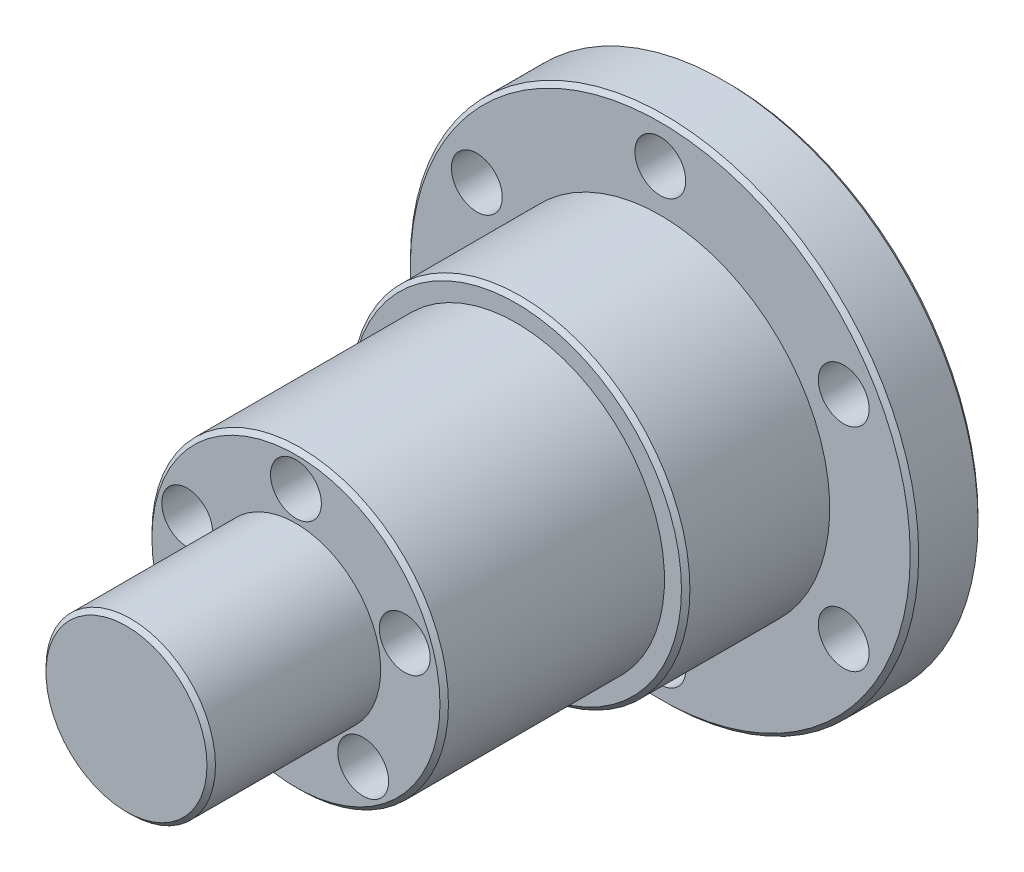
ISO-10303-21;
HEADER;
FILE_DESCRIPTION(('STEP AP214'),'2;1');
FILE_NAME('part.step','',(''),(''),'','','');
FILE_SCHEMA(('AUTOMOTIVE_DESIGN { 1 0 10303 214 1 1 1 1 }'));
ENDSEC;
DATA;
#1=APPLICATION_CONTEXT('core data for automotive mechanical design processes');
#2=APPLICATION_PROTOCOL_DEFINITION('international standard','automotive_design',2000,#1);
#3=PRODUCT_CONTEXT('',#1,'mechanical');
#4=PRODUCT('Part','Part','',(#3));
#5=PRODUCT_RELATED_PRODUCT_CATEGORY('part','',(#4));
#6=PRODUCT_DEFINITION_FORMATION('','',#4);
#7=PRODUCT_DEFINITION_CONTEXT('part definition',#1,'design');
#8=PRODUCT_DEFINITION('design','',#6,#7);
#9=PRODUCT_DEFINITION_SHAPE('','',#8);
#10=(LENGTH_UNIT() NAMED_UNIT(*) SI_UNIT(.MILLI.,.METRE.));
#11=(NAMED_UNIT(*) PLANE_ANGLE_UNIT() SI_UNIT($,.RADIAN.));
#12=(NAMED_UNIT(*) SI_UNIT($,.STERADIAN.) SOLID_ANGLE_UNIT());
#13=UNCERTAINTY_MEASURE_WITH_UNIT(LENGTH_MEASURE(1.E-05),#10,'distance_accuracy_value','');
#14=(GEOMETRIC_REPRESENTATION_CONTEXT(3) GLOBAL_UNCERTAINTY_ASSIGNED_CONTEXT((#13)) GLOBAL_UNIT_ASSIGNED_CONTEXT((#10,
#11,#12)) REPRESENTATION_CONTEXT('',''));
#15=CARTESIAN_POINT('',(0.,0.,0.));
#16=DIRECTION('',(0.,0.,1.));
#17=DIRECTION('',(1.,0.,0.));
#18=AXIS2_PLACEMENT_3D('',#15,#16,#17);
#19=CARTESIAN_POINT('',(0.,0.,0.));
#20=DIRECTION('',(0.,0.,1.));
#21=DIRECTION('',(1.,0.,0.));
#22=AXIS2_PLACEMENT_3D('',#19,#20,#21);
#23=PLANE('',#22);
#24=CARTESIAN_POINT('',(0.,0.,0.));
#25=DIRECTION('',(0.,0.,1.));
#26=DIRECTION('',(1.,0.,0.));
#27=AXIS2_PLACEMENT_3D('',#24,#25,#26);
#28=CIRCLE('',#27,9.49999999999999);
#29=CARTESIAN_POINT('',(9.49999999999999,0.,0.));
#30=VERTEX_POINT('',#29);
#31=EDGE_CURVE('E10',#30,#30,#28,.T.);
#32=ORIENTED_EDGE('',*,*,#31,.T.);
#33=EDGE_LOOP('',(#32));
#34=FACE_BOUND('',#33,.T.);
#35=ADVANCED_FACE('F35',(#34),#23,.T.);
#36=CARTESIAN_POINT('',(0.,0.,0.));
#37=DIRECTION('',(0.,0.,-1.));
#38=DIRECTION('',(-1.,0.,0.));
#39=AXIS2_PLACEMENT_3D('',#36,#37,#38);
#40=CYLINDRICAL_SURFACE('',#39,10.);
#41=CARTESIAN_POINT('',(0.,0.,-0.499999999999999));
#42=DIRECTION('',(0.,0.,1.));
#43=DIRECTION('',(1.,0.,0.));
#44=AXIS2_PLACEMENT_3D('',#41,#42,#43);
#45=CIRCLE('',#44,10.);
#46=CARTESIAN_POINT('',(10.,0.,-0.499999999999999));
#47=VERTEX_POINT('',#46);
#48=EDGE_CURVE('E43',#47,#47,#45,.F.);
#49=ORIENTED_EDGE('',*,*,#48,.T.);
#50=EDGE_LOOP('',(#49));
#51=FACE_BOUND('',#50,.T.);
#52=CARTESIAN_POINT('',(0.,0.,-20.));
#53=DIRECTION('',(0.,0.,-1.));
#54=DIRECTION('',(-1.,0.,0.));
#55=AXIS2_PLACEMENT_3D('',#52,#53,#54);
#56=CIRCLE('',#55,10.);
#57=CARTESIAN_POINT('',(-10.,0.,-20.));
#58=VERTEX_POINT('',#57);
#59=EDGE_CURVE('E74',#58,#58,#56,.T.);
#60=ORIENTED_EDGE('',*,*,#59,.F.);
#61=EDGE_LOOP('',(#60));
#62=FACE_BOUND('',#61,.T.);
#63=ADVANCED_FACE('F221',(#51,#62),#40,.T.);
#64=CARTESIAN_POINT('',(0.,10.,-20.));
#65=DIRECTION('',(0.,0.,1.));
#66=DIRECTION('',(1.,0.,0.));
#67=AXIS2_PLACEMENT_3D('',#64,#65,#66);
#68=PLANE('',#67);
#69=CARTESIAN_POINT('',(0.,0.,-20.));
#70=DIRECTION('',(0.,0.,1.));
#71=DIRECTION('',(1.,0.,0.));
#72=AXIS2_PLACEMENT_3D('',#69,#70,#71);
#73=CIRCLE('',#72,17.);
#74=CARTESIAN_POINT('',(17.,0.,-20.));
#75=VERTEX_POINT('',#74);
#76=EDGE_CURVE('E47',#75,#75,#73,.T.);
#77=ORIENTED_EDGE('',*,*,#76,.T.);
#78=EDGE_LOOP('',(#77));
#79=FACE_BOUND('',#78,.T.);
#80=CARTESIAN_POINT('',(12.8392629699845,4.17172942406194,-20.));
#81=DIRECTION('',(0.,0.,1.));
#82=DIRECTION('',(1.,0.,0.));
#83=AXIS2_PLACEMENT_3D('',#80,#81,#82);
#84=CIRCLE('',#83,2.99999999999999);
#85=CARTESIAN_POINT('',(15.8392629699845,4.17172942406194,-20.));
#86=VERTEX_POINT('',#85);
#87=EDGE_CURVE('E75',#86,#86,#84,.T.);
#88=ORIENTED_EDGE('',*,*,#87,.F.);
#89=EDGE_LOOP('',(#88));
#90=FACE_BOUND('',#89,.T.);
#91=CARTESIAN_POINT('',(7.93510090594848,-10.9217294240617,-20.));
#92=DIRECTION('',(0.,0.,1.));
#93=DIRECTION('',(1.,0.,0.));
#94=AXIS2_PLACEMENT_3D('',#91,#92,#93);
#95=CIRCLE('',#94,2.99999999999999);
#96=CARTESIAN_POINT('',(10.9351009059485,-10.9217294240617,-20.));
#97=VERTEX_POINT('',#96);
#98=EDGE_CURVE('E80',#97,#97,#95,.T.);
#99=ORIENTED_EDGE('',*,*,#98,.F.);
#100=EDGE_LOOP('',(#99));
#101=FACE_BOUND('',#100,.T.);
#102=CARTESIAN_POINT('',(-7.93510090594833,-10.9217294240618,-20.));
#103=DIRECTION('',(0.,0.,1.));
#104=DIRECTION('',(1.,0.,0.));
#105=AXIS2_PLACEMENT_3D('',#102,#103,#104);
#106=CIRCLE('',#105,2.99999999999999);
#107=CARTESIAN_POINT('',(-4.93510090594833,-10.9217294240618,-20.));
#108=VERTEX_POINT('',#107);
#109=EDGE_CURVE('E85',#108,#108,#106,.T.);
#110=ORIENTED_EDGE('',*,*,#109,.F.);
#111=EDGE_LOOP('',(#110));
#112=FACE_BOUND('',#111,.T.);
#113=CARTESIAN_POINT('',(-12.8392629699846,4.17172942406175,-20.));
#114=DIRECTION('',(0.,0.,1.));
#115=DIRECTION('',(1.,0.,0.));
#116=AXIS2_PLACEMENT_3D('',#113,#114,#115);
#117=CIRCLE('',#116,2.99999999999999);
#118=CARTESIAN_POINT('',(-9.8392629699846,4.17172942406175,-20.));
#119=VERTEX_POINT('',#118);
#120=EDGE_CURVE('E90',#119,#119,#117,.T.);
#121=ORIENTED_EDGE('',*,*,#120,.F.);
#122=EDGE_LOOP('',(#121));
#123=FACE_BOUND('',#122,.T.);
#124=CARTESIAN_POINT('',(0.,13.5,-20.));
#125=DIRECTION('',(0.,0.,1.));
#126=DIRECTION('',(1.,0.,0.));
#127=AXIS2_PLACEMENT_3D('',#124,#125,#126);
#128=CIRCLE('',#127,2.99999999999999);
#129=CARTESIAN_POINT('',(2.99999999999999,13.5,-20.));
#130=VERTEX_POINT('',#129);
#131=EDGE_CURVE('E95',#130,#130,#128,.T.);
#132=ORIENTED_EDGE('',*,*,#131,.F.);
#133=EDGE_LOOP('',(#132));
#134=FACE_BOUND('',#133,.T.);
#135=ORIENTED_EDGE('',*,*,#59,.T.);
#136=EDGE_LOOP('',(#135));
#137=FACE_BOUND('',#136,.T.);
#138=ADVANCED_FACE('F226',(#79,#90,#101,#112,#123,#134,#137),#68,.T.);
#139=CARTESIAN_POINT('',(0.,0.,0.));
#140=DIRECTION('',(0.,0.,-1.));
#141=DIRECTION('',(-1.,0.,0.));
#142=AXIS2_PLACEMENT_3D('',#139,#140,#141);
#143=CYLINDRICAL_SURFACE('',#142,17.5);
#144=CARTESIAN_POINT('',(0.,0.,-20.5));
#145=DIRECTION('',(0.,0.,1.));
#146=DIRECTION('',(1.,0.,0.));
#147=AXIS2_PLACEMENT_3D('',#144,#145,#146);
#148=CIRCLE('',#147,17.5);
#149=CARTESIAN_POINT('',(17.5,0.,-20.5));
#150=VERTEX_POINT('',#149);
#151=EDGE_CURVE('E51',#150,#150,#148,.F.);
#152=ORIENTED_EDGE('',*,*,#151,.T.);
#153=EDGE_LOOP('',(#152));
#154=FACE_BOUND('',#153,.T.);
#155=CARTESIAN_POINT('',(0.,0.,-46.));
#156=DIRECTION('',(0.,0.,-1.));
#157=DIRECTION('',(-1.,0.,0.));
#158=AXIS2_PLACEMENT_3D('',#155,#156,#157);
#159=CIRCLE('',#158,17.5);
#160=CARTESIAN_POINT('',(-17.5,0.,-46.));
#161=VERTEX_POINT('',#160);
#162=EDGE_CURVE('E102',#161,#161,#159,.T.);
#163=ORIENTED_EDGE('',*,*,#162,.F.);
#164=EDGE_LOOP('',(#163));
#165=FACE_BOUND('',#164,.T.);
#166=ADVANCED_FACE('F264',(#154,#165),#143,.T.);
#167=CARTESIAN_POINT('',(0.,17.5,-46.));
#168=DIRECTION('',(0.,0.,1.));
#169=DIRECTION('',(1.,0.,0.));
#170=AXIS2_PLACEMENT_3D('',#167,#168,#169);
#171=PLANE('',#170);
#172=CARTESIAN_POINT('',(0.,0.,-46.));
#173=DIRECTION('',(0.,0.,1.));
#174=DIRECTION('',(1.,0.,0.));
#175=AXIS2_PLACEMENT_3D('',#172,#173,#174);
#176=CIRCLE('',#175,19.5);
#177=CARTESIAN_POINT('',(19.5,0.,-46.));
#178=VERTEX_POINT('',#177);
#179=EDGE_CURVE('E56',#178,#178,#176,.T.);
#180=ORIENTED_EDGE('',*,*,#179,.T.);
#181=EDGE_LOOP('',(#180));
#182=FACE_BOUND('',#181,.T.);
#183=ORIENTED_EDGE('',*,*,#162,.T.);
#184=EDGE_LOOP('',(#183));
#185=FACE_BOUND('',#184,.T.);
#186=ADVANCED_FACE('F267',(#182,#185),#171,.T.);
#187=CARTESIAN_POINT('',(0.,0.,0.));
#188=DIRECTION('',(0.,0.,-1.));
#189=DIRECTION('',(-1.,0.,0.));
#190=AXIS2_PLACEMENT_3D('',#187,#188,#189);
#191=CYLINDRICAL_SURFACE('',#190,20.);
#192=CARTESIAN_POINT('',(0.,0.,-46.5));
#193=DIRECTION('',(0.,0.,1.));
#194=DIRECTION('',(1.,0.,0.));
#195=AXIS2_PLACEMENT_3D('',#192,#193,#194);
#196=CIRCLE('',#195,20.);
#197=CARTESIAN_POINT('',(20.,0.,-46.5));
#198=VERTEX_POINT('',#197);
#199=EDGE_CURVE('E59',#198,#198,#196,.F.);
#200=ORIENTED_EDGE('',*,*,#199,.T.);
#201=EDGE_LOOP('',(#200));
#202=FACE_BOUND('',#201,.T.);
#203=CARTESIAN_POINT('',(0.,0.,-63.));
#204=DIRECTION('',(0.,0.,-1.));
#205=DIRECTION('',(-1.,0.,0.));
#206=AXIS2_PLACEMENT_3D('',#203,#204,#205);
#207=CIRCLE('',#206,20.);
#208=CARTESIAN_POINT('',(-20.,0.,-63.));
#209=VERTEX_POINT('',#208);
#210=EDGE_CURVE('E105',#209,#209,#207,.T.);
#211=ORIENTED_EDGE('',*,*,#210,.F.);
#212=EDGE_LOOP('',(#211));
#213=FACE_BOUND('',#212,.T.);
#214=ADVANCED_FACE('F272',(#202,#213),#191,.T.);
#215=CARTESIAN_POINT('',(0.,20.,-63.));
#216=DIRECTION('',(0.,0.,1.));
#217=DIRECTION('',(1.,0.,0.));
#218=AXIS2_PLACEMENT_3D('',#215,#216,#217);
#219=PLANE('',#218);
#220=CARTESIAN_POINT('',(0.,0.,-63.));
#221=DIRECTION('',(0.,0.,1.));
#222=DIRECTION('',(1.,0.,0.));
#223=AXIS2_PLACEMENT_3D('',#220,#221,#222);
#224=CIRCLE('',#223,29.5);
#225=CARTESIAN_POINT('',(29.5,0.,-63.));
#226=VERTEX_POINT('',#225);
#227=EDGE_CURVE('E62',#226,#226,#224,.T.);
#228=ORIENTED_EDGE('',*,*,#227,.T.);
#229=EDGE_LOOP('',(#228));
#230=FACE_BOUND('',#229,.T.);
#231=CARTESIAN_POINT('',(0.,25.,-63.));
#232=DIRECTION('',(0.,0.,1.));
#233=DIRECTION('',(1.,0.,0.));
#234=AXIS2_PLACEMENT_3D('',#231,#232,#233);
#235=CIRCLE('',#234,3.);
#236=CARTESIAN_POINT('',(3.,25.,-63.));
#237=VERTEX_POINT('',#236);
#238=EDGE_CURVE('E108',#237,#237,#235,.T.);
#239=ORIENTED_EDGE('',*,*,#238,.F.);
#240=EDGE_LOOP('',(#239));
#241=FACE_BOUND('',#240,.T.);
#242=CARTESIAN_POINT('',(21.650635094611,12.5,-63.));
#243=DIRECTION('',(0.,0.,1.));
#244=DIRECTION('',(1.,0.,0.));
#245=AXIS2_PLACEMENT_3D('',#242,#243,#244);
#246=CIRCLE('',#245,2.99999999999999);
#247=CARTESIAN_POINT('',(24.650635094611,12.5,-63.));
#248=VERTEX_POINT('',#247);
#249=EDGE_CURVE('E111',#248,#248,#246,.T.);
#250=ORIENTED_EDGE('',*,*,#249,.F.);
#251=EDGE_LOOP('',(#250));
#252=FACE_BOUND('',#251,.T.);
#253=CARTESIAN_POINT('',(21.650635094611,-12.5,-63.));
#254=DIRECTION('',(0.,0.,1.));
#255=DIRECTION('',(1.,0.,0.));
#256=AXIS2_PLACEMENT_3D('',#253,#254,#255);
#257=CIRCLE('',#256,3.);
#258=CARTESIAN_POINT('',(24.650635094611,-12.5,-63.));
#259=VERTEX_POINT('',#258);
#260=EDGE_CURVE('E114',#259,#259,#257,.T.);
#261=ORIENTED_EDGE('',*,*,#260,.F.);
#262=EDGE_LOOP('',(#261));
#263=FACE_BOUND('',#262,.T.);
#264=CARTESIAN_POINT('',(0.,-25.,-63.));
#265=DIRECTION('',(0.,0.,1.));
#266=DIRECTION('',(1.,0.,0.));
#267=AXIS2_PLACEMENT_3D('',#264,#265,#266);
#268=CIRCLE('',#267,3.);
#269=CARTESIAN_POINT('',(3.,-25.,-63.));
#270=VERTEX_POINT('',#269);
#271=EDGE_CURVE('E117',#270,#270,#268,.T.);
#272=ORIENTED_EDGE('',*,*,#271,.F.);
#273=EDGE_LOOP('',(#272));
#274=FACE_BOUND('',#273,.T.);
#275=CARTESIAN_POINT('',(-21.650635094611,-12.5,-63.));
#276=DIRECTION('',(0.,0.,1.));
#277=DIRECTION('',(1.,0.,0.));
#278=AXIS2_PLACEMENT_3D('',#275,#276,#277);
#279=CIRCLE('',#278,3.);
#280=CARTESIAN_POINT('',(-18.650635094611,-12.5,-63.));
#281=VERTEX_POINT('',#280);
#282=EDGE_CURVE('E120',#281,#281,#279,.T.);
#283=ORIENTED_EDGE('',*,*,#282,.F.);
#284=EDGE_LOOP('',(#283));
#285=FACE_BOUND('',#284,.T.);
#286=CARTESIAN_POINT('',(-21.650635094611,12.5,-63.));
#287=DIRECTION('',(0.,0.,1.));
#288=DIRECTION('',(1.,0.,0.));
#289=AXIS2_PLACEMENT_3D('',#286,#287,#288);
#290=CIRCLE('',#289,3.);
#291=CARTESIAN_POINT('',(-18.650635094611,12.5,-63.));
#292=VERTEX_POINT('',#291);
#293=EDGE_CURVE('E123',#292,#292,#290,.T.);
#294=ORIENTED_EDGE('',*,*,#293,.F.);
#295=EDGE_LOOP('',(#294));
#296=FACE_BOUND('',#295,.T.);
#297=ORIENTED_EDGE('',*,*,#210,.T.);
#298=EDGE_LOOP('',(#297));
#299=FACE_BOUND('',#298,.T.);
#300=ADVANCED_FACE('F278',(#230,#241,#252,#263,#274,#285,#296,#299),#219,.T.);
#301=CARTESIAN_POINT('',(0.,0.,0.));
#302=DIRECTION('',(0.,0.,-1.));
#303=DIRECTION('',(-1.,0.,0.));
#304=AXIS2_PLACEMENT_3D('',#301,#302,#303);
#305=CYLINDRICAL_SURFACE('',#304,30.);
#306=CARTESIAN_POINT('',(0.,0.,-70.5));
#307=DIRECTION('',(0.,0.,-1.));
#308=DIRECTION('',(-1.,0.,0.));
#309=AXIS2_PLACEMENT_3D('',#306,#307,#308);
#310=CIRCLE('',#309,30.);
#311=CARTESIAN_POINT('',(-30.,0.,-70.5));
#312=VERTEX_POINT('',#311);
#313=EDGE_CURVE('E65',#312,#312,#310,.F.);
#314=ORIENTED_EDGE('',*,*,#313,.T.);
#315=EDGE_LOOP('',(#314));
#316=FACE_BOUND('',#315,.T.);
#317=CARTESIAN_POINT('',(0.,0.,-63.5));
#318=DIRECTION('',(0.,0.,1.));
#319=DIRECTION('',(1.,0.,0.));
#320=AXIS2_PLACEMENT_3D('',#317,#318,#319);
#321=CIRCLE('',#320,30.);
#322=CARTESIAN_POINT('',(30.,0.,-63.5));
#323=VERTEX_POINT('',#322);
#324=EDGE_CURVE('E68',#323,#323,#321,.F.);
#325=ORIENTED_EDGE('',*,*,#324,.T.);
#326=EDGE_LOOP('',(#325));
#327=FACE_BOUND('',#326,.T.);
#328=ADVANCED_FACE('F186',(#316,#327),#305,.T.);
#329=CARTESIAN_POINT('',(0.,30.,-71.));
#330=DIRECTION('',(0.,0.,-1.));
#331=DIRECTION('',(-1.,0.,0.));
#332=AXIS2_PLACEMENT_3D('',#329,#330,#331);
#333=PLANE('',#332);
#334=CARTESIAN_POINT('',(0.,0.,-71.));
#335=DIRECTION('',(0.,0.,-1.));
#336=DIRECTION('',(-1.,0.,0.));
#337=AXIS2_PLACEMENT_3D('',#334,#335,#336);
#338=CIRCLE('',#337,29.5);
#339=CARTESIAN_POINT('',(-29.5,0.,-71.));
#340=VERTEX_POINT('',#339);
#341=EDGE_CURVE('E71',#340,#340,#338,.T.);
#342=ORIENTED_EDGE('',*,*,#341,.T.);
#343=EDGE_LOOP('',(#342));
#344=FACE_BOUND('',#343,.T.);
#345=CARTESIAN_POINT('',(12.8392629699845,4.17172942406194,-71.));
#346=DIRECTION('',(0.,0.,-1.));
#347=DIRECTION('',(-1.,0.,0.));
#348=AXIS2_PLACEMENT_3D('',#345,#346,#347);
#349=CIRCLE('',#348,4.99999999999999);
#350=CARTESIAN_POINT('',(7.83926296998453,4.17172942406194,-71.));
#351=VERTEX_POINT('',#350);
#352=EDGE_CURVE('E176',#351,#351,#349,.T.);
#353=ORIENTED_EDGE('',*,*,#352,.F.);
#354=EDGE_LOOP('',(#353));
#355=FACE_BOUND('',#354,.T.);
#356=CARTESIAN_POINT('',(7.93510090594848,-10.9217294240617,-71.));
#357=DIRECTION('',(0.,0.,-1.));
#358=DIRECTION('',(-1.,0.,0.));
#359=AXIS2_PLACEMENT_3D('',#356,#357,#358);
#360=CIRCLE('',#359,4.99999999999999);
#361=CARTESIAN_POINT('',(2.93510090594849,-10.9217294240617,-71.));
#362=VERTEX_POINT('',#361);
#363=EDGE_CURVE('E78',#362,#362,#360,.T.);
#364=ORIENTED_EDGE('',*,*,#363,.F.);
#365=EDGE_LOOP('',(#364));
#366=FACE_BOUND('',#365,.T.);
#367=CARTESIAN_POINT('',(-7.93510090594833,-10.9217294240618,-71.));
#368=DIRECTION('',(0.,0.,-1.));
#369=DIRECTION('',(-1.,0.,0.));
#370=AXIS2_PLACEMENT_3D('',#367,#368,#369);
#371=CIRCLE('',#370,4.99999999999999);
#372=CARTESIAN_POINT('',(-12.9351009059483,-10.9217294240618,-71.));
#373=VERTEX_POINT('',#372);
#374=EDGE_CURVE('E83',#373,#373,#371,.T.);
#375=ORIENTED_EDGE('',*,*,#374,.F.);
#376=EDGE_LOOP('',(#375));
#377=FACE_BOUND('',#376,.T.);
#378=CARTESIAN_POINT('',(-12.8392629699846,4.17172942406175,-71.));
#379=DIRECTION('',(0.,0.,-1.));
#380=DIRECTION('',(-1.,0.,0.));
#381=AXIS2_PLACEMENT_3D('',#378,#379,#380);
#382=CIRCLE('',#381,4.99999999999999);
#383=CARTESIAN_POINT('',(-17.8392629699846,4.17172942406175,-71.));
#384=VERTEX_POINT('',#383);
#385=EDGE_CURVE('E88',#384,#384,#382,.T.);
#386=ORIENTED_EDGE('',*,*,#385,.F.);
#387=EDGE_LOOP('',(#386));
#388=FACE_BOUND('',#387,.T.);
#389=CARTESIAN_POINT('',(0.,13.5,-71.));
#390=DIRECTION('',(0.,0.,-1.));
#391=DIRECTION('',(-1.,0.,0.));
#392=AXIS2_PLACEMENT_3D('',#389,#390,#391);
#393=CIRCLE('',#392,4.99999999999999);
#394=CARTESIAN_POINT('',(-4.99999999999999,13.5,-71.));
#395=VERTEX_POINT('',#394);
#396=EDGE_CURVE('E93',#395,#395,#393,.T.);
#397=ORIENTED_EDGE('',*,*,#396,.F.);
#398=EDGE_LOOP('',(#397));
#399=FACE_BOUND('',#398,.T.);
#400=CARTESIAN_POINT('',(0.,25.,-71.));
#401=DIRECTION('',(0.,0.,-1.));
#402=DIRECTION('',(-1.,0.,0.));
#403=AXIS2_PLACEMENT_3D('',#400,#401,#402);
#404=CIRCLE('',#403,3.);
#405=CARTESIAN_POINT('',(-3.,25.,-71.));
#406=VERTEX_POINT('',#405);
#407=EDGE_CURVE('E126',#406,#406,#404,.T.);
#408=ORIENTED_EDGE('',*,*,#407,.F.);
#409=EDGE_LOOP('',(#408));
#410=FACE_BOUND('',#409,.T.);
#411=CARTESIAN_POINT('',(21.650635094611,12.5,-71.));
#412=DIRECTION('',(0.,0.,-1.));
#413=DIRECTION('',(-1.,0.,0.));
#414=AXIS2_PLACEMENT_3D('',#411,#412,#413);
#415=CIRCLE('',#414,2.99999999999999);
#416=CARTESIAN_POINT('',(18.650635094611,12.5,-71.));
#417=VERTEX_POINT('',#416);
#418=EDGE_CURVE('E98',#417,#417,#415,.T.);
#419=ORIENTED_EDGE('',*,*,#418,.F.);
#420=EDGE_LOOP('',(#419));
#421=FACE_BOUND('',#420,.T.);
#422=CARTESIAN_POINT('',(21.650635094611,-12.5,-71.));
#423=DIRECTION('',(0.,0.,-1.));
#424=DIRECTION('',(-1.,0.,0.));
#425=AXIS2_PLACEMENT_3D('',#422,#423,#424);
#426=CIRCLE('',#425,3.);
#427=CARTESIAN_POINT('',(18.650635094611,-12.5,-71.));
#428=VERTEX_POINT('',#427);
#429=EDGE_CURVE('E127',#428,#428,#426,.T.);
#430=ORIENTED_EDGE('',*,*,#429,.F.);
#431=EDGE_LOOP('',(#430));
#432=FACE_BOUND('',#431,.T.);
#433=CARTESIAN_POINT('',(0.,-25.,-71.));
#434=DIRECTION('',(0.,0.,-1.));
#435=DIRECTION('',(-1.,0.,0.));
#436=AXIS2_PLACEMENT_3D('',#433,#434,#435);
#437=CIRCLE('',#436,3.);
#438=CARTESIAN_POINT('',(-3.,-25.,-71.));
#439=VERTEX_POINT('',#438);
#440=EDGE_CURVE('E130',#439,#439,#437,.T.);
#441=ORIENTED_EDGE('',*,*,#440,.F.);
#442=EDGE_LOOP('',(#441));
#443=FACE_BOUND('',#442,.T.);
#444=CARTESIAN_POINT('',(-21.650635094611,-12.5,-71.));
#445=DIRECTION('',(0.,0.,-1.));
#446=DIRECTION('',(-1.,0.,0.));
#447=AXIS2_PLACEMENT_3D('',#444,#445,#446);
#448=CIRCLE('',#447,3.);
#449=CARTESIAN_POINT('',(-24.650635094611,-12.5,-71.));
#450=VERTEX_POINT('',#449);
#451=EDGE_CURVE('E133',#450,#450,#448,.T.);
#452=ORIENTED_EDGE('',*,*,#451,.F.);
#453=EDGE_LOOP('',(#452));
#454=FACE_BOUND('',#453,.T.);
#455=CARTESIAN_POINT('',(-21.650635094611,12.5,-71.));
#456=DIRECTION('',(0.,0.,-1.));
#457=DIRECTION('',(-1.,0.,0.));
#458=AXIS2_PLACEMENT_3D('',#455,#456,#457);
#459=CIRCLE('',#458,3.);
#460=CARTESIAN_POINT('',(-24.650635094611,12.5,-71.));
#461=VERTEX_POINT('',#460);
#462=EDGE_CURVE('E136',#461,#461,#459,.T.);
#463=ORIENTED_EDGE('',*,*,#462,.F.);
#464=EDGE_LOOP('',(#463));
#465=FACE_BOUND('',#464,.T.);
#466=ADVANCED_FACE('F182',(#344,#355,#366,#377,#388,#399,#410,#421,#432,#443,#454,#465),#333,.T.);
#467=CARTESIAN_POINT('',(-21.650635094611,12.5,-61.));
#468=DIRECTION('',(0.,0.,-1.));
#469=DIRECTION('',(-1.,0.,0.));
#470=AXIS2_PLACEMENT_3D('',#467,#468,#469);
#471=CYLINDRICAL_SURFACE('',#470,3.);
#472=ORIENTED_EDGE('',*,*,#293,.T.);
#473=EDGE_LOOP('',(#472));
#474=FACE_BOUND('',#473,.T.);
#475=ORIENTED_EDGE('',*,*,#462,.T.);
#476=EDGE_LOOP('',(#475));
#477=FACE_BOUND('',#476,.T.);
#478=ADVANCED_FACE('F185',(#474,#477),#471,.F.);
#479=CARTESIAN_POINT('',(-21.650635094611,-12.5,-61.));
#480=DIRECTION('',(0.,0.,-1.));
#481=DIRECTION('',(-1.,0.,0.));
#482=AXIS2_PLACEMENT_3D('',#479,#480,#481);
#483=CYLINDRICAL_SURFACE('',#482,3.);
#484=ORIENTED_EDGE('',*,*,#282,.T.);
#485=EDGE_LOOP('',(#484));
#486=FACE_BOUND('',#485,.T.);
#487=ORIENTED_EDGE('',*,*,#451,.T.);
#488=EDGE_LOOP('',(#487));
#489=FACE_BOUND('',#488,.T.);
#490=ADVANCED_FACE('F210',(#486,#489),#483,.F.);
#491=CARTESIAN_POINT('',(0.,-25.,-61.));
#492=DIRECTION('',(0.,0.,-1.));
#493=DIRECTION('',(-1.,0.,0.));
#494=AXIS2_PLACEMENT_3D('',#491,#492,#493);
#495=CYLINDRICAL_SURFACE('',#494,3.);
#496=ORIENTED_EDGE('',*,*,#271,.T.);
#497=EDGE_LOOP('',(#496));
#498=FACE_BOUND('',#497,.T.);
#499=ORIENTED_EDGE('',*,*,#440,.T.);
#500=EDGE_LOOP('',(#499));
#501=FACE_BOUND('',#500,.T.);
#502=ADVANCED_FACE('F216',(#498,#501),#495,.F.);
#503=CARTESIAN_POINT('',(21.650635094611,-12.5,-61.));
#504=DIRECTION('',(0.,0.,-1.));
#505=DIRECTION('',(-1.,0.,0.));
#506=AXIS2_PLACEMENT_3D('',#503,#504,#505);
#507=CYLINDRICAL_SURFACE('',#506,3.);
#508=ORIENTED_EDGE('',*,*,#260,.T.);
#509=EDGE_LOOP('',(#508));
#510=FACE_BOUND('',#509,.T.);
#511=ORIENTED_EDGE('',*,*,#429,.T.);
#512=EDGE_LOOP('',(#511));
#513=FACE_BOUND('',#512,.T.);
#514=ADVANCED_FACE('F330',(#510,#513),#507,.F.);
#515=CARTESIAN_POINT('',(21.650635094611,12.5,-61.));
#516=DIRECTION('',(0.,0.,-1.));
#517=DIRECTION('',(-1.,0.,0.));
#518=AXIS2_PLACEMENT_3D('',#515,#516,#517);
#519=CYLINDRICAL_SURFACE('',#518,2.99999999999999);
#520=ORIENTED_EDGE('',*,*,#249,.T.);
#521=EDGE_LOOP('',(#520));
#522=FACE_BOUND('',#521,.T.);
#523=ORIENTED_EDGE('',*,*,#418,.T.);
#524=EDGE_LOOP('',(#523));
#525=FACE_BOUND('',#524,.T.);
#526=ADVANCED_FACE('F327',(#522,#525),#519,.F.);
#527=CARTESIAN_POINT('',(0.,25.,-61.));
#528=DIRECTION('',(0.,0.,-1.));
#529=DIRECTION('',(-1.,0.,0.));
#530=AXIS2_PLACEMENT_3D('',#527,#528,#529);
#531=CYLINDRICAL_SURFACE('',#530,3.);
#532=ORIENTED_EDGE('',*,*,#238,.T.);
#533=EDGE_LOOP('',(#532));
#534=FACE_BOUND('',#533,.T.);
#535=ORIENTED_EDGE('',*,*,#407,.T.);
#536=EDGE_LOOP('',(#535));
#537=FACE_BOUND('',#536,.T.);
#538=ADVANCED_FACE('F304',(#534,#537),#531,.F.);
#539=CARTESIAN_POINT('',(0.,13.5,-71.));
#540=DIRECTION('',(0.,0.,-1.));
#541=DIRECTION('',(-1.,0.,0.));
#542=AXIS2_PLACEMENT_3D('',#539,#540,#541);
#543=CYLINDRICAL_SURFACE('',#542,2.99999999999999);
#544=ORIENTED_EDGE('',*,*,#131,.T.);
#545=EDGE_LOOP('',(#544));
#546=FACE_BOUND('',#545,.T.);
#547=CARTESIAN_POINT('',(0.,13.5,-65.));
#548=DIRECTION('',(0.,0.,-1.));
#549=DIRECTION('',(-1.,0.,0.));
#550=AXIS2_PLACEMENT_3D('',#547,#548,#549);
#551=CIRCLE('',#550,3.00000000000001);
#552=CARTESIAN_POINT('',(-3.00000000000001,13.5,-65.));
#553=VERTEX_POINT('',#552);
#554=EDGE_CURVE('E99',#553,#553,#551,.T.);
#555=ORIENTED_EDGE('',*,*,#554,.T.);
#556=EDGE_LOOP('',(#555));
#557=FACE_BOUND('',#556,.T.);
#558=ADVANCED_FACE('F300',(#546,#557),#543,.F.);
#559=CARTESIAN_POINT('',(3.00000000000001,13.5,-65.));
#560=DIRECTION('',(0.,0.,1.));
#561=DIRECTION('',(1.,0.,0.));
#562=AXIS2_PLACEMENT_3D('',#559,#560,#561);
#563=PLANE('',#562);
#564=ORIENTED_EDGE('',*,*,#554,.F.);
#565=EDGE_LOOP('',(#564));
#566=FACE_BOUND('',#565,.T.);
#567=CARTESIAN_POINT('',(0.,13.5,-65.));
#568=DIRECTION('',(0.,0.,-1.));
#569=DIRECTION('',(-1.,0.,0.));
#570=AXIS2_PLACEMENT_3D('',#567,#568,#569);
#571=CIRCLE('',#570,5.);
#572=CARTESIAN_POINT('',(-5.,13.5,-65.));
#573=VERTEX_POINT('',#572);
#574=EDGE_CURVE('E145',#573,#573,#571,.T.);
#575=ORIENTED_EDGE('',*,*,#574,.T.);
#576=EDGE_LOOP('',(#575));
#577=FACE_BOUND('',#576,.T.);
#578=ADVANCED_FACE('F303',(#566,#577),#563,.F.);
#579=CARTESIAN_POINT('',(0.,13.5,-71.));
#580=DIRECTION('',(0.,0.,-1.));
#581=DIRECTION('',(-1.,0.,0.));
#582=AXIS2_PLACEMENT_3D('',#579,#580,#581);
#583=CYLINDRICAL_SURFACE('',#582,5.);
#584=ORIENTED_EDGE('',*,*,#574,.F.);
#585=EDGE_LOOP('',(#584));
#586=FACE_BOUND('',#585,.T.);
#587=ORIENTED_EDGE('',*,*,#396,.T.);
#588=EDGE_LOOP('',(#587));
#589=FACE_BOUND('',#588,.T.);
#590=ADVANCED_FACE('F310',(#586,#589),#583,.F.);
#591=CARTESIAN_POINT('',(-12.8392629699846,4.17172942406175,-71.));
#592=DIRECTION('',(0.,0.,-1.));
#593=DIRECTION('',(-1.,0.,0.));
#594=AXIS2_PLACEMENT_3D('',#591,#592,#593);
#595=CYLINDRICAL_SURFACE('',#594,2.99999999999999);
#596=ORIENTED_EDGE('',*,*,#120,.T.);
#597=EDGE_LOOP('',(#596));
#598=FACE_BOUND('',#597,.T.);
#599=CARTESIAN_POINT('',(-12.8392629699846,4.17172942406175,-65.));
#600=DIRECTION('',(0.,0.,-1.));
#601=DIRECTION('',(-1.,0.,0.));
#602=AXIS2_PLACEMENT_3D('',#599,#600,#601);
#603=CIRCLE('',#602,3.00000000000001);
#604=CARTESIAN_POINT('',(-15.8392629699846,4.17172942406175,-65.));
#605=VERTEX_POINT('',#604);
#606=EDGE_CURVE('E94',#605,#605,#603,.T.);
#607=ORIENTED_EDGE('',*,*,#606,.T.);
#608=EDGE_LOOP('',(#607));
#609=FACE_BOUND('',#608,.T.);
#610=ADVANCED_FACE('F316',(#598,#609),#595,.F.);
#611=CARTESIAN_POINT('',(-9.83926296998458,4.17172942406175,-65.));
#612=DIRECTION('',(0.,0.,1.));
#613=DIRECTION('',(1.,0.,0.));
#614=AXIS2_PLACEMENT_3D('',#611,#612,#613);
#615=PLANE('',#614);
#616=ORIENTED_EDGE('',*,*,#606,.F.);
#617=EDGE_LOOP('',(#616));
#618=FACE_BOUND('',#617,.T.);
#619=CARTESIAN_POINT('',(-12.8392629699846,4.17172942406175,-65.));
#620=DIRECTION('',(0.,0.,-1.));
#621=DIRECTION('',(-1.,0.,0.));
#622=AXIS2_PLACEMENT_3D('',#619,#620,#621);
#623=CIRCLE('',#622,5.);
#624=CARTESIAN_POINT('',(-17.8392629699846,4.17172942406175,-65.));
#625=VERTEX_POINT('',#624);
#626=EDGE_CURVE('E152',#625,#625,#623,.T.);
#627=ORIENTED_EDGE('',*,*,#626,.T.);
#628=EDGE_LOOP('',(#627));
#629=FACE_BOUND('',#628,.T.);
#630=ADVANCED_FACE('F321',(#618,#629),#615,.F.);
#631=CARTESIAN_POINT('',(-12.8392629699846,4.17172942406175,-71.));
#632=DIRECTION('',(0.,0.,-1.));
#633=DIRECTION('',(-1.,0.,0.));
#634=AXIS2_PLACEMENT_3D('',#631,#632,#633);
#635=CYLINDRICAL_SURFACE('',#634,5.);
#636=ORIENTED_EDGE('',*,*,#626,.F.);
#637=EDGE_LOOP('',(#636));
#638=FACE_BOUND('',#637,.T.);
#639=ORIENTED_EDGE('',*,*,#385,.T.);
#640=EDGE_LOOP('',(#639));
#641=FACE_BOUND('',#640,.T.);
#642=ADVANCED_FACE('F478',(#638,#641),#635,.F.);
#643=CARTESIAN_POINT('',(-7.93510090594833,-10.9217294240618,-71.));
#644=DIRECTION('',(0.,0.,-1.));
#645=DIRECTION('',(-1.,0.,0.));
#646=AXIS2_PLACEMENT_3D('',#643,#644,#645);
#647=CYLINDRICAL_SURFACE('',#646,2.99999999999999);
#648=ORIENTED_EDGE('',*,*,#109,.T.);
#649=EDGE_LOOP('',(#648));
#650=FACE_BOUND('',#649,.T.);
#651=CARTESIAN_POINT('',(-7.93510090594833,-10.9217294240618,-65.));
#652=DIRECTION('',(0.,0.,-1.));
#653=DIRECTION('',(-1.,0.,0.));
#654=AXIS2_PLACEMENT_3D('',#651,#652,#653);
#655=CIRCLE('',#654,3.00000000000001);
#656=CARTESIAN_POINT('',(-10.9351009059483,-10.9217294240618,-65.));
#657=VERTEX_POINT('',#656);
#658=EDGE_CURVE('E89',#657,#657,#655,.T.);
#659=ORIENTED_EDGE('',*,*,#658,.T.);
#660=EDGE_LOOP('',(#659));
#661=FACE_BOUND('',#660,.T.);
#662=ADVANCED_FACE('F470',(#650,#661),#647,.F.);
#663=CARTESIAN_POINT('',(-4.93510090594832,-10.9217294240618,-65.));
#664=DIRECTION('',(0.,0.,1.));
#665=DIRECTION('',(1.,0.,0.));
#666=AXIS2_PLACEMENT_3D('',#663,#664,#665);
#667=PLANE('',#666);
#668=ORIENTED_EDGE('',*,*,#658,.F.);
#669=EDGE_LOOP('',(#668));
#670=FACE_BOUND('',#669,.T.);
#671=CARTESIAN_POINT('',(-7.93510090594833,-10.9217294240618,-65.));
#672=DIRECTION('',(0.,0.,-1.));
#673=DIRECTION('',(-1.,0.,0.));
#674=AXIS2_PLACEMENT_3D('',#671,#672,#673);
#675=CIRCLE('',#674,5.);
#676=CARTESIAN_POINT('',(-12.9351009059483,-10.9217294240618,-65.));
#677=VERTEX_POINT('',#676);
#678=EDGE_CURVE('E159',#677,#677,#675,.T.);
#679=ORIENTED_EDGE('',*,*,#678,.T.);
#680=EDGE_LOOP('',(#679));
#681=FACE_BOUND('',#680,.T.);
#682=ADVANCED_FACE('F462',(#670,#681),#667,.F.);
#683=CARTESIAN_POINT('',(-7.93510090594833,-10.9217294240618,-71.));
#684=DIRECTION('',(0.,0.,-1.));
#685=DIRECTION('',(-1.,0.,0.));
#686=AXIS2_PLACEMENT_3D('',#683,#684,#685);
#687=CYLINDRICAL_SURFACE('',#686,5.);
#688=ORIENTED_EDGE('',*,*,#678,.F.);
#689=EDGE_LOOP('',(#688));
#690=FACE_BOUND('',#689,.T.);
#691=ORIENTED_EDGE('',*,*,#374,.T.);
#692=EDGE_LOOP('',(#691));
#693=FACE_BOUND('',#692,.T.);
#694=ADVANCED_FACE('F454',(#690,#693),#687,.F.);
#695=CARTESIAN_POINT('',(7.93510090594848,-10.9217294240617,-71.));
#696=DIRECTION('',(0.,0.,-1.));
#697=DIRECTION('',(-1.,0.,0.));
#698=AXIS2_PLACEMENT_3D('',#695,#696,#697);
#699=CYLINDRICAL_SURFACE('',#698,2.99999999999999);
#700=ORIENTED_EDGE('',*,*,#98,.T.);
#701=EDGE_LOOP('',(#700));
#702=FACE_BOUND('',#701,.T.);
#703=CARTESIAN_POINT('',(7.93510090594848,-10.9217294240617,-65.));
#704=DIRECTION('',(0.,0.,-1.));
#705=DIRECTION('',(-1.,0.,0.));
#706=AXIS2_PLACEMENT_3D('',#703,#704,#705);
#707=CIRCLE('',#706,3.00000000000001);
#708=CARTESIAN_POINT('',(4.93510090594848,-10.9217294240617,-65.));
#709=VERTEX_POINT('',#708);
#710=EDGE_CURVE('E84',#709,#709,#707,.T.);
#711=ORIENTED_EDGE('',*,*,#710,.T.);
#712=EDGE_LOOP('',(#711));
#713=FACE_BOUND('',#712,.T.);
#714=ADVANCED_FACE('F446',(#702,#713),#699,.F.);
#715=CARTESIAN_POINT('',(10.9351009059485,-10.9217294240617,-65.));
#716=DIRECTION('',(0.,0.,1.));
#717=DIRECTION('',(1.,0.,0.));
#718=AXIS2_PLACEMENT_3D('',#715,#716,#717);
#719=PLANE('',#718);
#720=ORIENTED_EDGE('',*,*,#710,.F.);
#721=EDGE_LOOP('',(#720));
#722=FACE_BOUND('',#721,.T.);
#723=CARTESIAN_POINT('',(7.93510090594848,-10.9217294240617,-65.));
#724=DIRECTION('',(0.,0.,-1.));
#725=DIRECTION('',(-1.,0.,0.));
#726=AXIS2_PLACEMENT_3D('',#723,#724,#725);
#727=CIRCLE('',#726,5.);
#728=CARTESIAN_POINT('',(2.93510090594848,-10.9217294240617,-65.));
#729=VERTEX_POINT('',#728);
#730=EDGE_CURVE('E166',#729,#729,#727,.T.);
#731=ORIENTED_EDGE('',*,*,#730,.T.);
#732=EDGE_LOOP('',(#731));
#733=FACE_BOUND('',#732,.T.);
#734=ADVANCED_FACE('F438',(#722,#733),#719,.F.);
#735=CARTESIAN_POINT('',(7.93510090594848,-10.9217294240617,-71.));
#736=DIRECTION('',(0.,0.,-1.));
#737=DIRECTION('',(-1.,0.,0.));
#738=AXIS2_PLACEMENT_3D('',#735,#736,#737);
#739=CYLINDRICAL_SURFACE('',#738,5.);
#740=ORIENTED_EDGE('',*,*,#730,.F.);
#741=EDGE_LOOP('',(#740));
#742=FACE_BOUND('',#741,.T.);
#743=ORIENTED_EDGE('',*,*,#363,.T.);
#744=EDGE_LOOP('',(#743));
#745=FACE_BOUND('',#744,.T.);
#746=ADVANCED_FACE('F430',(#742,#745),#739,.F.);
#747=CARTESIAN_POINT('',(12.8392629699845,4.17172942406194,-71.));
#748=DIRECTION('',(0.,0.,-1.));
#749=DIRECTION('',(-1.,0.,0.));
#750=AXIS2_PLACEMENT_3D('',#747,#748,#749);
#751=CYLINDRICAL_SURFACE('',#750,2.99999999999999);
#752=ORIENTED_EDGE('',*,*,#87,.T.);
#753=EDGE_LOOP('',(#752));
#754=FACE_BOUND('',#753,.T.);
#755=CARTESIAN_POINT('',(12.8392629699845,4.17172942406194,-65.));
#756=DIRECTION('',(0.,0.,-1.));
#757=DIRECTION('',(-1.,0.,0.));
#758=AXIS2_PLACEMENT_3D('',#755,#756,#757);
#759=CIRCLE('',#758,3.00000000000001);
#760=CARTESIAN_POINT('',(9.83926296998452,4.17172942406194,-65.));
#761=VERTEX_POINT('',#760);
#762=EDGE_CURVE('E79',#761,#761,#759,.T.);
#763=ORIENTED_EDGE('',*,*,#762,.T.);
#764=EDGE_LOOP('',(#763));
#765=FACE_BOUND('',#764,.T.);
#766=ADVANCED_FACE('F422',(#754,#765),#751,.F.);
#767=CARTESIAN_POINT('',(15.8392629699845,4.17172942406194,-65.));
#768=DIRECTION('',(0.,0.,1.));
#769=DIRECTION('',(1.,0.,0.));
#770=AXIS2_PLACEMENT_3D('',#767,#768,#769);
#771=PLANE('',#770);
#772=ORIENTED_EDGE('',*,*,#762,.F.);
#773=EDGE_LOOP('',(#772));
#774=FACE_BOUND('',#773,.T.);
#775=CARTESIAN_POINT('',(12.8392629699845,4.17172942406194,-65.));
#776=DIRECTION('',(0.,0.,-1.));
#777=DIRECTION('',(-1.,0.,0.));
#778=AXIS2_PLACEMENT_3D('',#775,#776,#777);
#779=CIRCLE('',#778,5.);
#780=CARTESIAN_POINT('',(7.83926296998453,4.17172942406194,-65.));
#781=VERTEX_POINT('',#780);
#782=EDGE_CURVE('E173',#781,#781,#779,.T.);
#783=ORIENTED_EDGE('',*,*,#782,.T.);
#784=EDGE_LOOP('',(#783));
#785=FACE_BOUND('',#784,.T.);
#786=ADVANCED_FACE('F415',(#774,#785),#771,.F.);
#787=CARTESIAN_POINT('',(12.8392629699845,4.17172942406194,-71.));
#788=DIRECTION('',(0.,0.,-1.));
#789=DIRECTION('',(-1.,0.,0.));
#790=AXIS2_PLACEMENT_3D('',#787,#788,#789);
#791=CYLINDRICAL_SURFACE('',#790,5.);
#792=ORIENTED_EDGE('',*,*,#782,.F.);
#793=EDGE_LOOP('',(#792));
#794=FACE_BOUND('',#793,.T.);
#795=ORIENTED_EDGE('',*,*,#352,.T.);
#796=EDGE_LOOP('',(#795));
#797=FACE_BOUND('',#796,.T.);
#798=ADVANCED_FACE('F180',(#794,#797),#791,.F.);
#799=CARTESIAN_POINT('',(0.,0.,-71.));
#800=DIRECTION('',(0.,0.,1.));
#801=DIRECTION('',(1.,0.,0.));
#802=AXIS2_PLACEMENT_3D('',#799,#800,#801);
#803=CONICAL_SURFACE('',#802,29.5,0.785398163397445);
#804=ORIENTED_EDGE('',*,*,#313,.F.);
#805=EDGE_LOOP('',(#804));
#806=FACE_BOUND('',#805,.T.);
#807=ORIENTED_EDGE('',*,*,#341,.F.);
#808=EDGE_LOOP('',(#807));
#809=FACE_BOUND('',#808,.T.);
#810=ADVANCED_FACE('F231',(#806,#809),#803,.T.);
#811=CARTESIAN_POINT('',(0.,0.,-63.5));
#812=DIRECTION('',(0.,0.,-1.));
#813=DIRECTION('',(-1.,0.,0.));
#814=AXIS2_PLACEMENT_3D('',#811,#812,#813);
#815=CONICAL_SURFACE('',#814,30.,0.785398163397452);
#816=ORIENTED_EDGE('',*,*,#227,.F.);
#817=EDGE_LOOP('',(#816));
#818=FACE_BOUND('',#817,.T.);
#819=ORIENTED_EDGE('',*,*,#324,.F.);
#820=EDGE_LOOP('',(#819));
#821=FACE_BOUND('',#820,.T.);
#822=ADVANCED_FACE('F237',(#818,#821),#815,.T.);
#823=CARTESIAN_POINT('',(0.,0.,-46.5));
#824=DIRECTION('',(0.,0.,-1.));
#825=DIRECTION('',(-1.,0.,0.));
#826=AXIS2_PLACEMENT_3D('',#823,#824,#825);
#827=CONICAL_SURFACE('',#826,20.,0.785398163397455);
#828=ORIENTED_EDGE('',*,*,#179,.F.);
#829=EDGE_LOOP('',(#828));
#830=FACE_BOUND('',#829,.T.);
#831=ORIENTED_EDGE('',*,*,#199,.F.);
#832=EDGE_LOOP('',(#831));
#833=FACE_BOUND('',#832,.T.);
#834=ADVANCED_FACE('F244',(#830,#833),#827,.T.);
#835=CARTESIAN_POINT('',(0.,0.,-20.5));
#836=DIRECTION('',(0.,0.,-1.));
#837=DIRECTION('',(-1.,0.,0.));
#838=AXIS2_PLACEMENT_3D('',#835,#836,#837);
#839=CONICAL_SURFACE('',#838,17.5,0.785398163397455);
#840=ORIENTED_EDGE('',*,*,#76,.F.);
#841=EDGE_LOOP('',(#840));
#842=FACE_BOUND('',#841,.T.);
#843=ORIENTED_EDGE('',*,*,#151,.F.);
#844=EDGE_LOOP('',(#843));
#845=FACE_BOUND('',#844,.T.);
#846=ADVANCED_FACE('F250',(#842,#845),#839,.T.);
#847=CARTESIAN_POINT('',(0.,0.,-0.499999999999999));
#848=DIRECTION('',(0.,0.,-1.));
#849=DIRECTION('',(-1.,0.,0.));
#850=AXIS2_PLACEMENT_3D('',#847,#848,#849);
#851=CONICAL_SURFACE('',#850,10.,0.785398163397455);
#852=ORIENTED_EDGE('',*,*,#31,.F.);
#853=EDGE_LOOP('',(#852));
#854=FACE_BOUND('',#853,.T.);
#855=ORIENTED_EDGE('',*,*,#48,.F.);
#856=EDGE_LOOP('',(#855));
#857=FACE_BOUND('',#856,.T.);
#858=ADVANCED_FACE('F38',(#854,#857),#851,.T.);
#859=CLOSED_SHELL('',(#35,#63,#138,#166,#186,#214,#300,#328,#466,#478,#490,#502,#514,#526,#538,
#558,#578,#590,#610,#630,#642,#662,#682,#694,#714,#734,#746,#766,#786,#798,#810,#822,#834,#846,#858));
#860=MANIFOLD_SOLID_BREP('B2',#859);
#861=ADVANCED_BREP_SHAPE_REPRESENTATION('',(#18,#860),#14);
#862=SHAPE_DEFINITION_REPRESENTATION(#9,#861);
ENDSEC;
END-ISO-10303-21;
